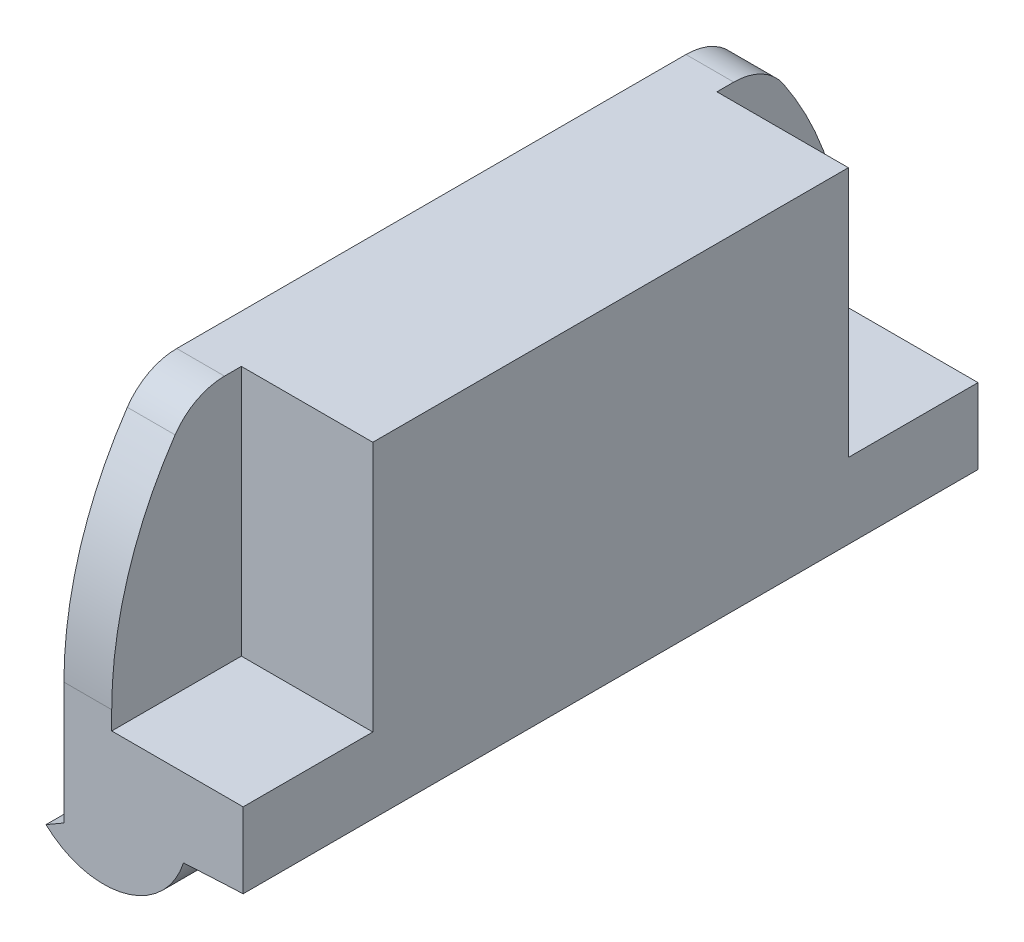
ISO-10303-21;
HEADER;
FILE_DESCRIPTION(('STEP AP214'),'2;1');
FILE_NAME('part.step','',(''),(''),'','','');
FILE_SCHEMA(('AUTOMOTIVE_DESIGN { 1 0 10303 214 1 1 1 1 }'));
ENDSEC;
DATA;
#1=APPLICATION_CONTEXT('core data for automotive mechanical design processes');
#2=APPLICATION_PROTOCOL_DEFINITION('international standard','automotive_design',2000,#1);
#3=PRODUCT_CONTEXT('',#1,'mechanical');
#4=PRODUCT('Part','Part','',(#3));
#5=PRODUCT_RELATED_PRODUCT_CATEGORY('part','',(#4));
#6=PRODUCT_DEFINITION_FORMATION('','',#4);
#7=PRODUCT_DEFINITION_CONTEXT('part definition',#1,'design');
#8=PRODUCT_DEFINITION('design','',#6,#7);
#9=PRODUCT_DEFINITION_SHAPE('','',#8);
#10=(LENGTH_UNIT() NAMED_UNIT(*) SI_UNIT(.MILLI.,.METRE.));
#11=(NAMED_UNIT(*) PLANE_ANGLE_UNIT() SI_UNIT($,.RADIAN.));
#12=(NAMED_UNIT(*) SI_UNIT($,.STERADIAN.) SOLID_ANGLE_UNIT());
#13=UNCERTAINTY_MEASURE_WITH_UNIT(LENGTH_MEASURE(1.E-05),#10,'distance_accuracy_value','');
#14=(GEOMETRIC_REPRESENTATION_CONTEXT(3) GLOBAL_UNCERTAINTY_ASSIGNED_CONTEXT((#13)) GLOBAL_UNIT_ASSIGNED_CONTEXT((#10,
#11,#12)) REPRESENTATION_CONTEXT('',''));
#15=CARTESIAN_POINT('',(0.,0.,0.));
#16=DIRECTION('',(0.,0.,1.));
#17=DIRECTION('',(1.,0.,0.));
#18=AXIS2_PLACEMENT_3D('',#15,#16,#17);
#19=CARTESIAN_POINT('',(0.299997713090983,1.78159871871872,12.3));
#20=DIRECTION('',(1.,0.,0.));
#21=DIRECTION('',(0.,0.,-1.));
#22=AXIS2_PLACEMENT_3D('',#19,#20,#21);
#23=PLANE('',#22);
#24=DIRECTION('',(0.,0.,-1.));
#25=VECTOR('',#24,1.);
#26=CARTESIAN_POINT('',(0.299997713090983,6.10745871871872,12.3));
#27=LINE('',#26,#25);
#28=CARTESIAN_POINT('',(0.299997713090983,6.10745872971482,10.4118765496414));
#29=VERTEX_POINT('',#28);
#30=CARTESIAN_POINT('',(0.299997713090983,6.10745872971482,1.88812345035856));
#31=VERTEX_POINT('',#30);
#32=EDGE_CURVE('E311',#29,#31,#27,.T.);
#33=ORIENTED_EDGE('',*,*,#32,.T.);
#34=CARTESIAN_POINT('',(0.299997713090983,5.10776748306749,1.88812345035856));
#35=DIRECTION('',(1.,0.,0.));
#36=DIRECTION('',(0.,0.,-1.));
#37=AXIS2_PLACEMENT_3D('',#34,#35,#36);
#38=CIRCLE('',#37,0.999691279635657);
#39=CARTESIAN_POINT('',(0.299997713090983,5.66904327195863,1.06086765957545));
#40=VERTEX_POINT('',#39);
#41=EDGE_CURVE('E206',#40,#31,#38,.T.);
#42=ORIENTED_EDGE('',*,*,#41,.F.);
#43=CARTESIAN_POINT('',(0.299997713090983,2.21592966698313,6.15035892658956));
#44=DIRECTION('',(1.,0.,0.));
#45=DIRECTION('',(0.,0.,-1.));
#46=AXIS2_PLACEMENT_3D('',#43,#44,#45);
#47=CIRCLE('',#46,6.15035892658956);
#48=CARTESIAN_POINT('',(0.299997713090983,2.21592966698313,0.));
#49=VERTEX_POINT('',#48);
#50=EDGE_CURVE('E213',#49,#40,#47,.T.);
#51=ORIENTED_EDGE('',*,*,#50,.F.);
#52=DIRECTION('',(0.,-1.,0.));
#53=VECTOR('',#52,1.);
#54=CARTESIAN_POINT('',(0.299997713090983,1.78159871871872,0.));
#55=LINE('',#54,#53);
#56=CARTESIAN_POINT('',(0.299997713090983,0.173208718718719,0.));
#57=VERTEX_POINT('',#56);
#58=EDGE_CURVE('E303',#49,#57,#55,.T.);
#59=ORIENTED_EDGE('',*,*,#58,.T.);
#60=DIRECTION('',(0.,0.,-1.));
#61=VECTOR('',#60,1.);
#62=CARTESIAN_POINT('',(0.299997713090983,0.173208718718719,12.3));
#63=LINE('',#62,#61);
#64=CARTESIAN_POINT('',(0.299997713090983,0.173208718718719,12.3));
#65=VERTEX_POINT('',#64);
#66=EDGE_CURVE('E308',#65,#57,#63,.T.);
#67=ORIENTED_EDGE('',*,*,#66,.F.);
#68=DIRECTION('',(0.,-1.,0.));
#69=VECTOR('',#68,1.);
#70=CARTESIAN_POINT('',(0.299997713090982,6.10745871871872,12.3));
#71=LINE('',#70,#69);
#72=CARTESIAN_POINT('',(0.299997713090983,2.21592966698313,12.3));
#73=VERTEX_POINT('',#72);
#74=EDGE_CURVE('E291',#73,#65,#71,.T.);
#75=ORIENTED_EDGE('',*,*,#74,.F.);
#76=CARTESIAN_POINT('',(0.299997713090983,2.21592966698313,6.14964107341044));
#77=DIRECTION('',(1.,0.,0.));
#78=DIRECTION('',(0.,0.,1.));
#79=AXIS2_PLACEMENT_3D('',#76,#77,#78);
#80=CIRCLE('',#79,6.15035892658956);
#81=CARTESIAN_POINT('',(0.299997713090983,5.66904327195863,11.2391323404246));
#82=VERTEX_POINT('',#81);
#83=EDGE_CURVE('E227',#82,#73,#80,.T.);
#84=ORIENTED_EDGE('',*,*,#83,.F.);
#85=CARTESIAN_POINT('',(0.299997713090983,5.10776748306749,10.4118765496414));
#86=DIRECTION('',(1.,0.,0.));
#87=DIRECTION('',(0.,0.,1.));
#88=AXIS2_PLACEMENT_3D('',#85,#86,#87);
#89=CIRCLE('',#88,0.999691279635658);
#90=EDGE_CURVE('E229',#29,#82,#89,.T.);
#91=ORIENTED_EDGE('',*,*,#90,.F.);
#92=EDGE_LOOP('',(#33,#42,#51,#59,#67,#75,#84,#91));
#93=FACE_BOUND('',#92,.T.);
#94=DIRECTION('',(0.,0.,1.));
#95=VECTOR('',#94,1.);
#96=CARTESIAN_POINT('',(0.299997713090983,4.37320871871872,3.00889598376581));
#97=LINE('',#96,#95);
#98=CARTESIAN_POINT('',(0.299997713090983,4.37320871871872,4.65));
#99=VERTEX_POINT('',#98);
#100=CARTESIAN_POINT('',(0.299997713090983,4.37320871871872,7.65));
#101=VERTEX_POINT('',#100);
#102=EDGE_CURVE('E183',#99,#101,#97,.T.);
#103=ORIENTED_EDGE('',*,*,#102,.T.);
#104=DIRECTION('',(0.,1.,0.));
#105=VECTOR('',#104,1.);
#106=CARTESIAN_POINT('',(0.299997713090983,2.78159871871872,7.65));
#107=LINE('',#106,#105);
#108=CARTESIAN_POINT('',(0.299997713090983,1.78159871871872,7.65));
#109=VERTEX_POINT('',#108);
#110=EDGE_CURVE('E56',#109,#101,#107,.T.);
#111=ORIENTED_EDGE('',*,*,#110,.F.);
#112=DIRECTION('',(0.,0.,1.));
#113=VECTOR('',#112,1.);
#114=CARTESIAN_POINT('',(0.299997713090983,1.78159871871872,4.65));
#115=LINE('',#114,#113);
#116=CARTESIAN_POINT('',(0.299997713090983,1.78159871871872,4.65));
#117=VERTEX_POINT('',#116);
#118=EDGE_CURVE('E51',#117,#109,#115,.T.);
#119=ORIENTED_EDGE('',*,*,#118,.F.);
#120=DIRECTION('',(0.,-1.,0.));
#121=VECTOR('',#120,1.);
#122=CARTESIAN_POINT('',(0.299997713090983,2.78159871871872,4.65));
#123=LINE('',#122,#121);
#124=EDGE_CURVE('E188',#99,#117,#123,.T.);
#125=ORIENTED_EDGE('',*,*,#124,.F.);
#126=EDGE_LOOP('',(#103,#111,#119,#125));
#127=FACE_BOUND('',#126,.T.);
#128=ADVANCED_FACE('F35',(#93,#127),#23,.F.);
#129=CARTESIAN_POINT('',(0.299997713090982,6.10745871871872,12.3));
#130=DIRECTION('',(0.,-1.,0.));
#131=DIRECTION('',(0.,0.,-1.));
#132=AXIS2_PLACEMENT_3D('',#129,#130,#131);
#133=PLANE('',#132);
#134=DIRECTION('',(1.,0.,0.));
#135=VECTOR('',#134,1.);
#136=CARTESIAN_POINT('',(3.29999771309098,6.10745871871872,2.17));
#137=LINE('',#136,#135);
#138=CARTESIAN_POINT('',(1.09999771309098,6.10745871871872,2.17));
#139=VERTEX_POINT('',#138);
#140=CARTESIAN_POINT('',(3.29999771309098,6.10745871871872,2.17));
#141=VERTEX_POINT('',#140);
#142=EDGE_CURVE('E261',#139,#141,#137,.T.);
#143=ORIENTED_EDGE('',*,*,#142,.F.);
#144=DIRECTION('',(0.,0.,1.));
#145=VECTOR('',#144,1.);
#146=CARTESIAN_POINT('',(1.09999771309098,6.10745871871872,0.));
#147=LINE('',#146,#145);
#148=CARTESIAN_POINT('',(1.09999771309098,6.10745872971482,1.88812345035856));
#149=VERTEX_POINT('',#148);
#150=EDGE_CURVE('E39',#149,#139,#147,.T.);
#151=ORIENTED_EDGE('',*,*,#150,.F.);
#152=DIRECTION('',(-1.,0.,0.));
#153=VECTOR('',#152,1.);
#154=CARTESIAN_POINT('',(5.42551835218583,6.10745874071093,1.88812345035856));
#155=LINE('',#154,#153);
#156=EDGE_CURVE('E209',#31,#149,#155,.F.);
#157=ORIENTED_EDGE('',*,*,#156,.F.);
#158=ORIENTED_EDGE('',*,*,#32,.F.);
#159=DIRECTION('',(-1.,0.,0.));
#160=VECTOR('',#159,1.);
#161=CARTESIAN_POINT('',(5.42551835218583,6.10745874071093,10.4118765496414));
#162=LINE('',#161,#160);
#163=CARTESIAN_POINT('',(1.09999771309098,6.10745872971482,10.4118765496414));
#164=VERTEX_POINT('',#163);
#165=EDGE_CURVE('E226',#29,#164,#162,.F.);
#166=ORIENTED_EDGE('',*,*,#165,.T.);
#167=DIRECTION('',(0.,0.,1.));
#168=VECTOR('',#167,1.);
#169=CARTESIAN_POINT('',(1.09999771309098,6.10745871871872,12.3));
#170=LINE('',#169,#168);
#171=CARTESIAN_POINT('',(1.09999771309098,6.10745871871872,10.13));
#172=VERTEX_POINT('',#171);
#173=EDGE_CURVE('E240',#172,#164,#170,.T.);
#174=ORIENTED_EDGE('',*,*,#173,.F.);
#175=DIRECTION('',(-1.,0.,0.));
#176=VECTOR('',#175,1.);
#177=CARTESIAN_POINT('',(3.29999771309098,6.10745871871872,10.13));
#178=LINE('',#177,#176);
#179=CARTESIAN_POINT('',(3.29999771309098,6.10745871871872,10.13));
#180=VERTEX_POINT('',#179);
#181=EDGE_CURVE('E248',#180,#172,#178,.T.);
#182=ORIENTED_EDGE('',*,*,#181,.F.);
#183=DIRECTION('',(0.,0.,-1.));
#184=VECTOR('',#183,1.);
#185=CARTESIAN_POINT('',(3.29999771309098,6.10745871871872,12.3));
#186=LINE('',#185,#184);
#187=EDGE_CURVE('E312',#180,#141,#186,.T.);
#188=ORIENTED_EDGE('',*,*,#187,.T.);
#189=EDGE_LOOP('',(#143,#151,#157,#158,#166,#174,#182,#188));
#190=FACE_BOUND('',#189,.T.);
#191=ADVANCED_FACE('F334',(#190),#133,.F.);
#192=CARTESIAN_POINT('',(0.963377245375444,1.02074692549378,0.));
#193=DIRECTION('',(0.,0.,-1.));
#194=DIRECTION('',(-1.,0.,0.));
#195=AXIS2_PLACEMENT_3D('',#192,#193,#194);
#196=PLANE('',#195);
#197=ORIENTED_EDGE('',*,*,#58,.F.);
#198=DIRECTION('',(-1.,0.,0.));
#199=VECTOR('',#198,1.);
#200=CARTESIAN_POINT('',(5.42551835218583,2.21592966698313,0.));
#201=LINE('',#200,#199);
#202=CARTESIAN_POINT('',(1.09999771309098,2.21592966698313,0.));
#203=VERTEX_POINT('',#202);
#204=EDGE_CURVE('E216',#203,#49,#201,.T.);
#205=ORIENTED_EDGE('',*,*,#204,.F.);
#206=DIRECTION('',(0.,1.,0.));
#207=VECTOR('',#206,1.);
#208=CARTESIAN_POINT('',(1.09999771309098,1.90745871871872,0.));
#209=LINE('',#208,#207);
#210=CARTESIAN_POINT('',(1.09999771309098,1.90745871871872,0.));
#211=VERTEX_POINT('',#210);
#212=EDGE_CURVE('E270',#211,#203,#209,.T.);
#213=ORIENTED_EDGE('',*,*,#212,.F.);
#214=DIRECTION('',(-1.,0.,0.));
#215=VECTOR('',#214,1.);
#216=CARTESIAN_POINT('',(3.29999771309098,1.90745871871872,0.));
#217=LINE('',#216,#215);
#218=CARTESIAN_POINT('',(3.29999771309098,1.90745871871872,0.));
#219=VERTEX_POINT('',#218);
#220=EDGE_CURVE('E260',#219,#211,#217,.T.);
#221=ORIENTED_EDGE('',*,*,#220,.F.);
#222=DIRECTION('',(0.,1.,0.));
#223=VECTOR('',#222,1.);
#224=CARTESIAN_POINT('',(3.29999771309098,6.10745871871872,0.));
#225=LINE('',#224,#223);
#226=CARTESIAN_POINT('',(3.29999771309098,0.646828718718718,0.));
#227=VERTEX_POINT('',#226);
#228=EDGE_CURVE('E300',#227,#219,#225,.T.);
#229=ORIENTED_EDGE('',*,*,#228,.F.);
#230=CARTESIAN_POINT('',(8.56489986113116,-113.555405572176,0.));
#231=DIRECTION('',(0.,0.,-1.));
#232=DIRECTION('',(1.,0.,0.));
#233=AXIS2_PLACEMENT_3D('',#230,#231,#232);
#234=CIRCLE('',#233,114.32353);
#235=CARTESIAN_POINT('',(2.30126966708194,0.596407591054324,0.));
#236=VERTEX_POINT('',#235);
#237=EDGE_CURVE('E298',#236,#227,#234,.T.);
#238=ORIENTED_EDGE('',*,*,#237,.F.);
#239=CARTESIAN_POINT('',(0.963377245375444,1.02074692549378,0.));
#240=DIRECTION('',(0.,0.,1.));
#241=DIRECTION('',(-1.,0.,0.));
#242=AXIS2_PLACEMENT_3D('',#239,#240,#241);
#243=CIRCLE('',#242,1.40357401045053);
#244=CARTESIAN_POINT('',(0.,0.,0.));
#245=VERTEX_POINT('',#244);
#246=EDGE_CURVE('E276',#245,#236,#243,.T.);
#247=ORIENTED_EDGE('',*,*,#246,.F.);
#248=DIRECTION('',(-0.866019205828305,-0.500010735021271,0.));
#249=VECTOR('',#248,1.);
#250=CARTESIAN_POINT('',(0.,0.,0.));
#251=LINE('',#250,#249);
#252=EDGE_CURVE('E286',#57,#245,#251,.T.);
#253=ORIENTED_EDGE('',*,*,#252,.F.);
#254=EDGE_LOOP('',(#197,#205,#213,#221,#229,#238,#247,#253));
#255=FACE_BOUND('',#254,.T.);
#256=ADVANCED_FACE('F351',(#255),#196,.T.);
#257=CARTESIAN_POINT('',(0.963377245375444,1.02074692549378,12.3));
#258=DIRECTION('',(0.,0.,-1.));
#259=DIRECTION('',(-1.,0.,0.));
#260=AXIS2_PLACEMENT_3D('',#257,#258,#259);
#261=PLANE('',#260);
#262=DIRECTION('',(-1.,0.,0.));
#263=VECTOR('',#262,1.);
#264=CARTESIAN_POINT('',(5.42551835218583,2.21592966698313,12.3));
#265=LINE('',#264,#263);
#266=CARTESIAN_POINT('',(1.09999771309098,2.21592966698313,12.3));
#267=VERTEX_POINT('',#266);
#268=EDGE_CURVE('E231',#267,#73,#265,.T.);
#269=ORIENTED_EDGE('',*,*,#268,.T.);
#270=ORIENTED_EDGE('',*,*,#74,.T.);
#271=DIRECTION('',(-0.866019205828305,-0.500010735021271,0.));
#272=VECTOR('',#271,1.);
#273=CARTESIAN_POINT('',(0.,0.,12.3));
#274=LINE('',#273,#272);
#275=CARTESIAN_POINT('',(0.,0.,12.3));
#276=VERTEX_POINT('',#275);
#277=EDGE_CURVE('E293',#65,#276,#274,.T.);
#278=ORIENTED_EDGE('',*,*,#277,.T.);
#279=CARTESIAN_POINT('',(0.963377245375444,1.02074692549378,12.3));
#280=DIRECTION('',(0.,0.,1.));
#281=DIRECTION('',(-1.,0.,0.));
#282=AXIS2_PLACEMENT_3D('',#279,#280,#281);
#283=CIRCLE('',#282,1.40357401045053);
#284=CARTESIAN_POINT('',(2.30126966708194,0.596407591054324,12.3));
#285=VERTEX_POINT('',#284);
#286=EDGE_CURVE('E282',#276,#285,#283,.T.);
#287=ORIENTED_EDGE('',*,*,#286,.T.);
#288=CARTESIAN_POINT('',(8.56489986113116,-113.555405572176,12.3));
#289=DIRECTION('',(0.,0.,-1.));
#290=DIRECTION('',(1.,0.,0.));
#291=AXIS2_PLACEMENT_3D('',#288,#289,#290);
#292=CIRCLE('',#291,114.32353);
#293=CARTESIAN_POINT('',(3.29999771309098,0.646828718718718,12.3));
#294=VERTEX_POINT('',#293);
#295=EDGE_CURVE('E285',#285,#294,#292,.T.);
#296=ORIENTED_EDGE('',*,*,#295,.T.);
#297=DIRECTION('',(0.,1.,0.));
#298=VECTOR('',#297,1.);
#299=CARTESIAN_POINT('',(3.29999771309098,6.10745871871872,12.3));
#300=LINE('',#299,#298);
#301=CARTESIAN_POINT('',(3.29999771309098,1.90745871871872,12.3));
#302=VERTEX_POINT('',#301);
#303=EDGE_CURVE('E288',#294,#302,#300,.T.);
#304=ORIENTED_EDGE('',*,*,#303,.T.);
#305=DIRECTION('',(1.,0.,0.));
#306=VECTOR('',#305,1.);
#307=CARTESIAN_POINT('',(3.29999771309098,1.90745871871872,12.3));
#308=LINE('',#307,#306);
#309=CARTESIAN_POINT('',(1.09999771309098,1.90745871871872,12.3));
#310=VERTEX_POINT('',#309);
#311=EDGE_CURVE('E245',#310,#302,#308,.T.);
#312=ORIENTED_EDGE('',*,*,#311,.F.);
#313=DIRECTION('',(0.,1.,0.));
#314=VECTOR('',#313,1.);
#315=CARTESIAN_POINT('',(1.09999771309098,1.90745871871872,12.3));
#316=LINE('',#315,#314);
#317=EDGE_CURVE('E252',#310,#267,#316,.T.);
#318=ORIENTED_EDGE('',*,*,#317,.T.);
#319=EDGE_LOOP('',(#269,#270,#278,#287,#296,#304,#312,#318));
#320=FACE_BOUND('',#319,.T.);
#321=ADVANCED_FACE('F377',(#320),#261,.F.);
#322=CARTESIAN_POINT('',(0.963377245375444,1.02074692549378,12.3));
#323=DIRECTION('',(0.,0.,-1.));
#324=DIRECTION('',(-1.,0.,0.));
#325=AXIS2_PLACEMENT_3D('',#322,#323,#324);
#326=CYLINDRICAL_SURFACE('',#325,1.40357401045053);
#327=ORIENTED_EDGE('',*,*,#246,.T.);
#328=DIRECTION('',(0.,0.,-1.));
#329=VECTOR('',#328,1.);
#330=CARTESIAN_POINT('',(2.30126966708194,0.596407591054324,12.3));
#331=LINE('',#330,#329);
#332=EDGE_CURVE('E44',#285,#236,#331,.T.);
#333=ORIENTED_EDGE('',*,*,#332,.F.);
#334=ORIENTED_EDGE('',*,*,#286,.F.);
#335=DIRECTION('',(0.,0.,-1.));
#336=VECTOR('',#335,1.);
#337=CARTESIAN_POINT('',(0.,0.,12.3));
#338=LINE('',#337,#336);
#339=EDGE_CURVE('E295',#276,#245,#338,.T.);
#340=ORIENTED_EDGE('',*,*,#339,.T.);
#341=EDGE_LOOP('',(#327,#333,#334,#340));
#342=FACE_BOUND('',#341,.T.);
#343=ADVANCED_FACE('F37',(#342),#326,.T.);
#344=CARTESIAN_POINT('',(8.56489986113116,-113.555405572176,12.3));
#345=DIRECTION('',(0.,0.,-1.));
#346=DIRECTION('',(-1.,0.,0.));
#347=AXIS2_PLACEMENT_3D('',#344,#345,#346);
#348=CYLINDRICAL_SURFACE('',#347,114.32353);
#349=ORIENTED_EDGE('',*,*,#237,.T.);
#350=DIRECTION('',(0.,0.,-1.));
#351=VECTOR('',#350,1.);
#352=CARTESIAN_POINT('',(3.29999771309098,0.646828718718718,12.3));
#353=LINE('',#352,#351);
#354=EDGE_CURVE('E314',#294,#227,#353,.T.);
#355=ORIENTED_EDGE('',*,*,#354,.F.);
#356=ORIENTED_EDGE('',*,*,#295,.F.);
#357=ORIENTED_EDGE('',*,*,#332,.T.);
#358=EDGE_LOOP('',(#349,#355,#356,#357));
#359=FACE_BOUND('',#358,.T.);
#360=ADVANCED_FACE('F382',(#359),#348,.F.);
#361=CARTESIAN_POINT('',(3.29999771309098,6.10745871871872,12.3));
#362=DIRECTION('',(-1.,0.,0.));
#363=DIRECTION('',(0.,-1.,0.));
#364=AXIS2_PLACEMENT_3D('',#361,#362,#363);
#365=PLANE('',#364);
#366=ORIENTED_EDGE('',*,*,#187,.F.);
#367=DIRECTION('',(0.,1.,0.));
#368=VECTOR('',#367,1.);
#369=CARTESIAN_POINT('',(3.29999771309098,1.90745871871872,10.13));
#370=LINE('',#369,#368);
#371=CARTESIAN_POINT('',(3.29999771309098,1.90745871871872,10.13));
#372=VERTEX_POINT('',#371);
#373=EDGE_CURVE('E247',#372,#180,#370,.T.);
#374=ORIENTED_EDGE('',*,*,#373,.F.);
#375=DIRECTION('',(0.,0.,-1.));
#376=VECTOR('',#375,1.);
#377=CARTESIAN_POINT('',(3.29999771309098,1.90745871871872,12.3));
#378=LINE('',#377,#376);
#379=EDGE_CURVE('E236',#302,#372,#378,.T.);
#380=ORIENTED_EDGE('',*,*,#379,.F.);
#381=ORIENTED_EDGE('',*,*,#303,.F.);
#382=ORIENTED_EDGE('',*,*,#354,.T.);
#383=ORIENTED_EDGE('',*,*,#228,.T.);
#384=DIRECTION('',(0.,0.,-1.));
#385=VECTOR('',#384,1.);
#386=CARTESIAN_POINT('',(3.29999771309098,1.90745871871872,0.));
#387=LINE('',#386,#385);
#388=CARTESIAN_POINT('',(3.29999771309098,1.90745871871872,2.17));
#389=VERTEX_POINT('',#388);
#390=EDGE_CURVE('E258',#389,#219,#387,.T.);
#391=ORIENTED_EDGE('',*,*,#390,.F.);
#392=DIRECTION('',(0.,1.,0.));
#393=VECTOR('',#392,1.);
#394=CARTESIAN_POINT('',(3.29999771309098,1.90745871871872,2.17));
#395=LINE('',#394,#393);
#396=EDGE_CURVE('E273',#389,#141,#395,.T.);
#397=ORIENTED_EDGE('',*,*,#396,.T.);
#398=EDGE_LOOP('',(#366,#374,#380,#381,#382,#383,#391,#397));
#399=FACE_BOUND('',#398,.T.);
#400=ADVANCED_FACE('F342',(#399),#365,.F.);
#401=CARTESIAN_POINT('',(0.,0.,12.3));
#402=DIRECTION('',(0.500010735021271,-0.866019205828305,0.));
#403=DIRECTION('',(0.866019205828305,0.500010735021271,0.));
#404=AXIS2_PLACEMENT_3D('',#401,#402,#403);
#405=PLANE('',#404);
#406=ORIENTED_EDGE('',*,*,#252,.T.);
#407=ORIENTED_EDGE('',*,*,#339,.F.);
#408=ORIENTED_EDGE('',*,*,#277,.F.);
#409=ORIENTED_EDGE('',*,*,#66,.T.);
#410=EDGE_LOOP('',(#406,#407,#408,#409));
#411=FACE_BOUND('',#410,.T.);
#412=ADVANCED_FACE('F388',(#411),#405,.F.);
#413=CARTESIAN_POINT('',(3.29999771309098,1.90745871871872,2.17));
#414=DIRECTION('',(0.,0.,1.));
#415=DIRECTION('',(1.,0.,0.));
#416=AXIS2_PLACEMENT_3D('',#413,#414,#415);
#417=PLANE('',#416);
#418=ORIENTED_EDGE('',*,*,#142,.T.);
#419=ORIENTED_EDGE('',*,*,#396,.F.);
#420=DIRECTION('',(1.,0.,0.));
#421=VECTOR('',#420,1.);
#422=CARTESIAN_POINT('',(3.29999771309098,1.90745871871872,2.17));
#423=LINE('',#422,#421);
#424=CARTESIAN_POINT('',(1.09999771309098,1.90745871871872,2.17));
#425=VERTEX_POINT('',#424);
#426=EDGE_CURVE('E267',#425,#389,#423,.T.);
#427=ORIENTED_EDGE('',*,*,#426,.F.);
#428=DIRECTION('',(0.,1.,0.));
#429=VECTOR('',#428,1.);
#430=CARTESIAN_POINT('',(1.09999771309098,1.90745871871872,2.17));
#431=LINE('',#430,#429);
#432=EDGE_CURVE('E277',#425,#139,#431,.T.);
#433=ORIENTED_EDGE('',*,*,#432,.T.);
#434=EDGE_LOOP('',(#418,#419,#427,#433));
#435=FACE_BOUND('',#434,.T.);
#436=ADVANCED_FACE('F338',(#435),#417,.F.);
#437=CARTESIAN_POINT('',(1.09999771309098,1.90745871871872,0.));
#438=DIRECTION('',(-1.,0.,0.));
#439=DIRECTION('',(0.,0.,1.));
#440=AXIS2_PLACEMENT_3D('',#437,#438,#439);
#441=PLANE('',#440);
#442=CARTESIAN_POINT('',(1.09999771309098,2.21592966698313,6.15035892658956));
#443=DIRECTION('',(-1.,0.,0.));
#444=DIRECTION('',(0.,0.,1.));
#445=AXIS2_PLACEMENT_3D('',#442,#443,#444);
#446=CIRCLE('',#445,6.15035892658956);
#447=CARTESIAN_POINT('',(1.09999771309098,5.66904327195863,1.06086765957545));
#448=VERTEX_POINT('',#447);
#449=EDGE_CURVE('E207',#448,#203,#446,.T.);
#450=ORIENTED_EDGE('',*,*,#449,.F.);
#451=CARTESIAN_POINT('',(1.09999771309098,5.10776748306749,1.88812345035856));
#452=DIRECTION('',(-1.,0.,0.));
#453=DIRECTION('',(0.,0.,1.));
#454=AXIS2_PLACEMENT_3D('',#451,#452,#453);
#455=CIRCLE('',#454,0.999691279635657);
#456=EDGE_CURVE('E11',#448,#149,#455,.F.);
#457=ORIENTED_EDGE('',*,*,#456,.T.);
#458=ORIENTED_EDGE('',*,*,#150,.T.);
#459=ORIENTED_EDGE('',*,*,#432,.F.);
#460=DIRECTION('',(0.,0.,1.));
#461=VECTOR('',#460,1.);
#462=CARTESIAN_POINT('',(1.09999771309098,1.90745871871872,0.));
#463=LINE('',#462,#461);
#464=EDGE_CURVE('E264',#211,#425,#463,.T.);
#465=ORIENTED_EDGE('',*,*,#464,.F.);
#466=ORIENTED_EDGE('',*,*,#212,.T.);
#467=EDGE_LOOP('',(#450,#457,#458,#459,#465,#466));
#468=FACE_BOUND('',#467,.T.);
#469=ADVANCED_FACE('F332',(#468),#441,.F.);
#470=CARTESIAN_POINT('',(0.,1.90745871871872,0.));
#471=DIRECTION('',(0.,-1.,0.));
#472=DIRECTION('',(0.,0.,-1.));
#473=AXIS2_PLACEMENT_3D('',#470,#471,#472);
#474=PLANE('',#473);
#475=ORIENTED_EDGE('',*,*,#390,.T.);
#476=ORIENTED_EDGE('',*,*,#220,.T.);
#477=ORIENTED_EDGE('',*,*,#464,.T.);
#478=ORIENTED_EDGE('',*,*,#426,.T.);
#479=EDGE_LOOP('',(#475,#476,#477,#478));
#480=FACE_BOUND('',#479,.T.);
#481=ADVANCED_FACE('F347',(#480),#474,.F.);
#482=CARTESIAN_POINT('',(1.09999771309098,1.90745871871872,12.3));
#483=DIRECTION('',(-1.,0.,0.));
#484=DIRECTION('',(0.,0.,1.));
#485=AXIS2_PLACEMENT_3D('',#482,#483,#484);
#486=PLANE('',#485);
#487=CARTESIAN_POINT('',(1.09999771309098,5.10776748306749,10.4118765496414));
#488=DIRECTION('',(-1.,0.,0.));
#489=DIRECTION('',(0.,0.,1.));
#490=AXIS2_PLACEMENT_3D('',#487,#488,#489);
#491=CIRCLE('',#490,0.999691279635658);
#492=CARTESIAN_POINT('',(1.09999771309098,5.66904327195863,11.2391323404246));
#493=VERTEX_POINT('',#492);
#494=EDGE_CURVE('E219',#493,#164,#491,.T.);
#495=ORIENTED_EDGE('',*,*,#494,.F.);
#496=CARTESIAN_POINT('',(1.09999771309098,2.21592966698313,6.14964107341044));
#497=DIRECTION('',(-1.,0.,0.));
#498=DIRECTION('',(0.,0.,1.));
#499=AXIS2_PLACEMENT_3D('',#496,#497,#498);
#500=CIRCLE('',#499,6.15035892658956);
#501=EDGE_CURVE('E222',#267,#493,#500,.T.);
#502=ORIENTED_EDGE('',*,*,#501,.F.);
#503=ORIENTED_EDGE('',*,*,#317,.F.);
#504=DIRECTION('',(0.,0.,1.));
#505=VECTOR('',#504,1.);
#506=CARTESIAN_POINT('',(1.09999771309098,1.90745871871872,12.3));
#507=LINE('',#506,#505);
#508=CARTESIAN_POINT('',(1.09999771309098,1.90745871871872,10.13));
#509=VERTEX_POINT('',#508);
#510=EDGE_CURVE('E243',#509,#310,#507,.T.);
#511=ORIENTED_EDGE('',*,*,#510,.F.);
#512=DIRECTION('',(0.,1.,0.));
#513=VECTOR('',#512,1.);
#514=CARTESIAN_POINT('',(1.09999771309098,1.90745871871872,10.13));
#515=LINE('',#514,#513);
#516=EDGE_CURVE('E255',#509,#172,#515,.T.);
#517=ORIENTED_EDGE('',*,*,#516,.T.);
#518=ORIENTED_EDGE('',*,*,#173,.T.);
#519=EDGE_LOOP('',(#495,#502,#503,#511,#517,#518));
#520=FACE_BOUND('',#519,.T.);
#521=ADVANCED_FACE('F367',(#520),#486,.F.);
#522=CARTESIAN_POINT('',(3.29999771309098,1.90745871871872,10.13));
#523=DIRECTION('',(0.,0.,-1.));
#524=DIRECTION('',(-1.,0.,0.));
#525=AXIS2_PLACEMENT_3D('',#522,#523,#524);
#526=PLANE('',#525);
#527=ORIENTED_EDGE('',*,*,#181,.T.);
#528=ORIENTED_EDGE('',*,*,#516,.F.);
#529=DIRECTION('',(-1.,0.,0.));
#530=VECTOR('',#529,1.);
#531=CARTESIAN_POINT('',(3.29999771309098,1.90745871871872,10.13));
#532=LINE('',#531,#530);
#533=EDGE_CURVE('E239',#372,#509,#532,.T.);
#534=ORIENTED_EDGE('',*,*,#533,.F.);
#535=ORIENTED_EDGE('',*,*,#373,.T.);
#536=EDGE_LOOP('',(#527,#528,#534,#535));
#537=FACE_BOUND('',#536,.T.);
#538=ADVANCED_FACE('F371',(#537),#526,.F.);
#539=CARTESIAN_POINT('',(0.,1.90745871871872,0.));
#540=DIRECTION('',(0.,1.,0.));
#541=DIRECTION('',(0.,0.,1.));
#542=AXIS2_PLACEMENT_3D('',#539,#540,#541);
#543=PLANE('',#542);
#544=ORIENTED_EDGE('',*,*,#379,.T.);
#545=ORIENTED_EDGE('',*,*,#533,.T.);
#546=ORIENTED_EDGE('',*,*,#510,.T.);
#547=ORIENTED_EDGE('',*,*,#311,.T.);
#548=EDGE_LOOP('',(#544,#545,#546,#547));
#549=FACE_BOUND('',#548,.T.);
#550=ADVANCED_FACE('F399',(#549),#543,.T.);
#551=CARTESIAN_POINT('',(5.42551835218583,5.10776748306749,10.4118765496414));
#552=DIRECTION('',(-1.,0.,0.));
#553=DIRECTION('',(0.,0.,1.));
#554=AXIS2_PLACEMENT_3D('',#551,#552,#553);
#555=CYLINDRICAL_SURFACE('',#554,0.999691279635658);
#556=ORIENTED_EDGE('',*,*,#90,.T.);
#557=DIRECTION('',(-1.,0.,0.));
#558=VECTOR('',#557,1.);
#559=CARTESIAN_POINT('',(5.42551835218583,5.66904327195863,11.2391323404246));
#560=LINE('',#559,#558);
#561=EDGE_CURVE('E223',#493,#82,#560,.T.);
#562=ORIENTED_EDGE('',*,*,#561,.F.);
#563=ORIENTED_EDGE('',*,*,#494,.T.);
#564=ORIENTED_EDGE('',*,*,#165,.F.);
#565=EDGE_LOOP('',(#556,#562,#563,#564));
#566=FACE_BOUND('',#565,.T.);
#567=ADVANCED_FACE('F363',(#566),#555,.T.);
#568=CARTESIAN_POINT('',(5.42551835218583,2.21592966698313,6.14964107341044));
#569=DIRECTION('',(-1.,0.,0.));
#570=DIRECTION('',(0.,0.,1.));
#571=AXIS2_PLACEMENT_3D('',#568,#569,#570);
#572=CYLINDRICAL_SURFACE('',#571,6.15035892658956);
#573=ORIENTED_EDGE('',*,*,#501,.T.);
#574=ORIENTED_EDGE('',*,*,#561,.T.);
#575=ORIENTED_EDGE('',*,*,#83,.T.);
#576=ORIENTED_EDGE('',*,*,#268,.F.);
#577=EDGE_LOOP('',(#573,#574,#575,#576));
#578=FACE_BOUND('',#577,.T.);
#579=ADVANCED_FACE('F391',(#578),#572,.T.);
#580=CARTESIAN_POINT('',(5.42551835218583,5.10776748306749,1.88812345035856));
#581=DIRECTION('',(-1.,0.,0.));
#582=DIRECTION('',(0.,0.,1.));
#583=AXIS2_PLACEMENT_3D('',#580,#581,#582);
#584=CYLINDRICAL_SURFACE('',#583,0.999691279635657);
#585=ORIENTED_EDGE('',*,*,#156,.T.);
#586=ORIENTED_EDGE('',*,*,#456,.F.);
#587=DIRECTION('',(-1.,0.,0.));
#588=VECTOR('',#587,1.);
#589=CARTESIAN_POINT('',(5.42551835218583,5.66904327195863,1.06086765957545));
#590=LINE('',#589,#588);
#591=EDGE_CURVE('E210',#448,#40,#590,.T.);
#592=ORIENTED_EDGE('',*,*,#591,.T.);
#593=ORIENTED_EDGE('',*,*,#41,.T.);
#594=EDGE_LOOP('',(#585,#586,#592,#593));
#595=FACE_BOUND('',#594,.T.);
#596=ADVANCED_FACE('F325',(#595),#584,.T.);
#597=CARTESIAN_POINT('',(5.42551835218583,2.21592966698313,6.15035892658956));
#598=DIRECTION('',(-1.,0.,0.));
#599=DIRECTION('',(0.,0.,1.));
#600=AXIS2_PLACEMENT_3D('',#597,#598,#599);
#601=CYLINDRICAL_SURFACE('',#600,6.15035892658956);
#602=ORIENTED_EDGE('',*,*,#449,.T.);
#603=ORIENTED_EDGE('',*,*,#204,.T.);
#604=ORIENTED_EDGE('',*,*,#50,.T.);
#605=ORIENTED_EDGE('',*,*,#591,.F.);
#606=EDGE_LOOP('',(#602,#603,#604,#605));
#607=FACE_BOUND('',#606,.T.);
#608=ADVANCED_FACE('F356',(#607),#601,.T.);
#609=CARTESIAN_POINT('',(-0.100002286909017,2.78159871871872,4.65));
#610=DIRECTION('',(0.,0.,1.));
#611=DIRECTION('',(1.,0.,0.));
#612=AXIS2_PLACEMENT_3D('',#609,#610,#611);
#613=PLANE('',#612);
#614=ORIENTED_EDGE('',*,*,#124,.T.);
#615=DIRECTION('',(1.,0.,0.));
#616=VECTOR('',#615,1.);
#617=CARTESIAN_POINT('',(-0.100002286909017,1.78159871871872,4.65));
#618=LINE('',#617,#616);
#619=CARTESIAN_POINT('',(-0.100002286909017,1.78159871871872,4.65));
#620=VERTEX_POINT('',#619);
#621=EDGE_CURVE('E204',#620,#117,#618,.T.);
#622=ORIENTED_EDGE('',*,*,#621,.F.);
#623=DIRECTION('',(0.,-1.,0.));
#624=VECTOR('',#623,1.);
#625=CARTESIAN_POINT('',(-0.100002286909017,2.78159871871872,4.65));
#626=LINE('',#625,#624);
#627=CARTESIAN_POINT('',(-0.100002286909017,2.78159871871872,4.65));
#628=VERTEX_POINT('',#627);
#629=EDGE_CURVE('E178',#628,#620,#626,.T.);
#630=ORIENTED_EDGE('',*,*,#629,.F.);
#631=DIRECTION('',(0.24373835908212,0.969841024246735,0.));
#632=VECTOR('',#631,1.);
#633=CARTESIAN_POINT('',(0.299997713090983,4.37320871871872,4.65));
#634=LINE('',#633,#632);
#635=EDGE_CURVE('E190',#628,#99,#634,.T.);
#636=ORIENTED_EDGE('',*,*,#635,.T.);
#637=EDGE_LOOP('',(#614,#622,#630,#636));
#638=FACE_BOUND('',#637,.T.);
#639=ADVANCED_FACE('F467',(#638),#613,.F.);
#640=CARTESIAN_POINT('',(-0.100002286909017,1.78159871871872,4.65));
#641=DIRECTION('',(0.,1.,0.));
#642=DIRECTION('',(0.,0.,1.));
#643=AXIS2_PLACEMENT_3D('',#640,#641,#642);
#644=PLANE('',#643);
#645=ORIENTED_EDGE('',*,*,#118,.T.);
#646=DIRECTION('',(1.,0.,0.));
#647=VECTOR('',#646,1.);
#648=CARTESIAN_POINT('',(-0.100002286909017,1.78159871871872,7.65));
#649=LINE('',#648,#647);
#650=CARTESIAN_POINT('',(-0.100002286909017,1.78159871871872,7.65));
#651=VERTEX_POINT('',#650);
#652=EDGE_CURVE('E177',#651,#109,#649,.T.);
#653=ORIENTED_EDGE('',*,*,#652,.F.);
#654=DIRECTION('',(0.,0.,1.));
#655=VECTOR('',#654,1.);
#656=CARTESIAN_POINT('',(-0.100002286909017,1.78159871871872,4.65));
#657=LINE('',#656,#655);
#658=EDGE_CURVE('E196',#620,#651,#657,.T.);
#659=ORIENTED_EDGE('',*,*,#658,.F.);
#660=ORIENTED_EDGE('',*,*,#621,.T.);
#661=EDGE_LOOP('',(#645,#653,#659,#660));
#662=FACE_BOUND('',#661,.T.);
#663=ADVANCED_FACE('F474',(#662),#644,.F.);
#664=CARTESIAN_POINT('',(-0.100002286909017,2.78159871871872,7.65));
#665=DIRECTION('',(0.,0.,-1.));
#666=DIRECTION('',(0.,1.,0.));
#667=AXIS2_PLACEMENT_3D('',#664,#665,#666);
#668=PLANE('',#667);
#669=ORIENTED_EDGE('',*,*,#110,.T.);
#670=DIRECTION('',(-0.24373835908212,-0.969841024246735,0.));
#671=VECTOR('',#670,1.);
#672=CARTESIAN_POINT('',(0.299997713090983,4.37320871871872,7.65));
#673=LINE('',#672,#671);
#674=CARTESIAN_POINT('',(-0.100002286909017,2.78159871871872,7.65));
#675=VERTEX_POINT('',#674);
#676=EDGE_CURVE('E174',#101,#675,#673,.T.);
#677=ORIENTED_EDGE('',*,*,#676,.T.);
#678=DIRECTION('',(0.,1.,0.));
#679=VECTOR('',#678,1.);
#680=CARTESIAN_POINT('',(-0.100002286909017,2.78159871871872,7.65));
#681=LINE('',#680,#679);
#682=EDGE_CURVE('E198',#651,#675,#681,.T.);
#683=ORIENTED_EDGE('',*,*,#682,.F.);
#684=ORIENTED_EDGE('',*,*,#652,.T.);
#685=EDGE_LOOP('',(#669,#677,#683,#684));
#686=FACE_BOUND('',#685,.T.);
#687=ADVANCED_FACE('F172',(#686),#668,.F.);
#688=CARTESIAN_POINT('',(-0.100002286909017,0.,0.));
#689=DIRECTION('',(-1.,0.,0.));
#690=DIRECTION('',(0.,0.,1.));
#691=AXIS2_PLACEMENT_3D('',#688,#689,#690);
#692=PLANE('',#691);
#693=ORIENTED_EDGE('',*,*,#629,.T.);
#694=ORIENTED_EDGE('',*,*,#658,.T.);
#695=ORIENTED_EDGE('',*,*,#682,.T.);
#696=DIRECTION('',(0.,0.,-1.));
#697=VECTOR('',#696,1.);
#698=CARTESIAN_POINT('',(-0.100002286909017,2.78159871871872,4.65));
#699=LINE('',#698,#697);
#700=EDGE_CURVE('E185',#675,#628,#699,.T.);
#701=ORIENTED_EDGE('',*,*,#700,.T.);
#702=EDGE_LOOP('',(#693,#694,#695,#701));
#703=FACE_BOUND('',#702,.T.);
#704=ADVANCED_FACE('F503',(#703),#692,.T.);
#705=CARTESIAN_POINT('',(0.299997713090983,4.37320871871872,3.00889598376581));
#706=DIRECTION('',(-0.969841024246735,0.24373835908212,0.));
#707=DIRECTION('',(-0.24373835908212,-0.969841024246735,0.));
#708=AXIS2_PLACEMENT_3D('',#705,#706,#707);
#709=PLANE('',#708);
#710=ORIENTED_EDGE('',*,*,#635,.F.);
#711=ORIENTED_EDGE('',*,*,#700,.F.);
#712=ORIENTED_EDGE('',*,*,#676,.F.);
#713=ORIENTED_EDGE('',*,*,#102,.F.);
#714=EDGE_LOOP('',(#710,#711,#712,#713));
#715=FACE_BOUND('',#714,.T.);
#716=ADVANCED_FACE('F182',(#715),#709,.T.);
#717=CLOSED_SHELL('',(#128,#191,#256,#321,#343,#360,#400,#412,#436,#469,#481,#521,#538,#550,
#567,#579,#596,#608,#639,#663,#687,#704,#716));
#718=MANIFOLD_SOLID_BREP('B2',#717);
#719=ADVANCED_BREP_SHAPE_REPRESENTATION('',(#18,#718),#14);
#720=SHAPE_DEFINITION_REPRESENTATION(#9,#719);
ENDSEC;
END-ISO-10303-21;
